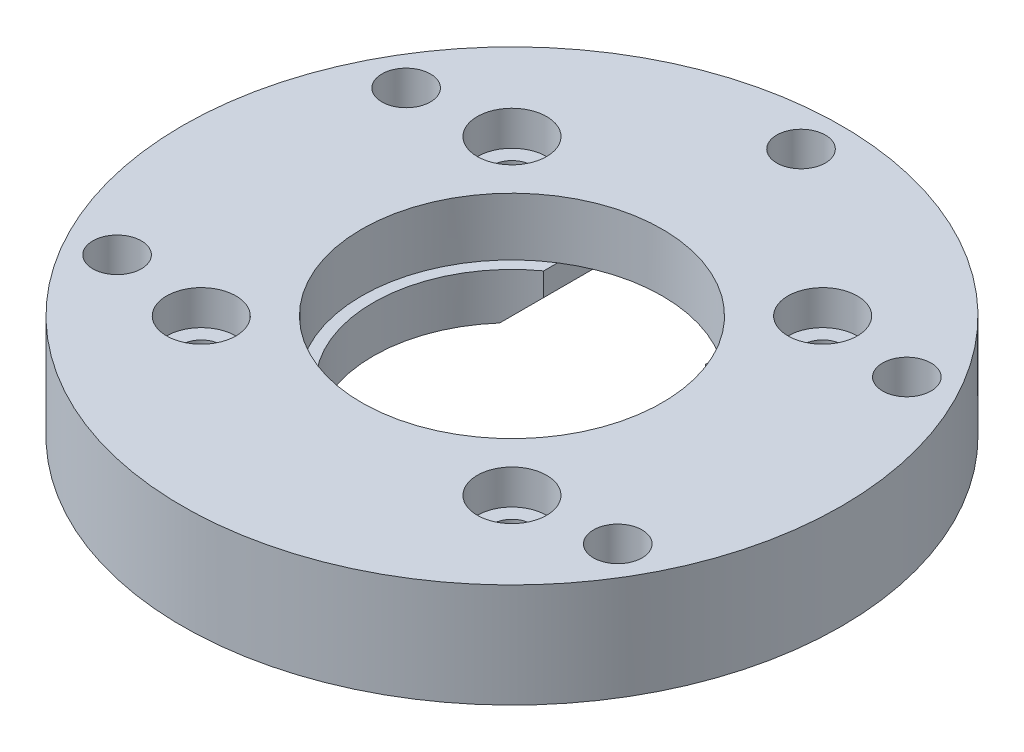
ISO-10303-21;
HEADER;
FILE_DESCRIPTION(('STEP AP214'),'2;1');
FILE_NAME('part.step','',(''),(''),'','','');
FILE_SCHEMA(('AUTOMOTIVE_DESIGN { 1 0 10303 214 1 1 1 1 }'));
ENDSEC;
DATA;
#1=APPLICATION_CONTEXT('core data for automotive mechanical design processes');
#2=APPLICATION_PROTOCOL_DEFINITION('international standard','automotive_design',2000,#1);
#3=PRODUCT_CONTEXT('',#1,'mechanical');
#4=PRODUCT('Part','Part','',(#3));
#5=PRODUCT_RELATED_PRODUCT_CATEGORY('part','',(#4));
#6=PRODUCT_DEFINITION_FORMATION('','',#4);
#7=PRODUCT_DEFINITION_CONTEXT('part definition',#1,'design');
#8=PRODUCT_DEFINITION('design','',#6,#7);
#9=PRODUCT_DEFINITION_SHAPE('','',#8);
#10=(LENGTH_UNIT() NAMED_UNIT(*) SI_UNIT(.MILLI.,.METRE.));
#11=(NAMED_UNIT(*) PLANE_ANGLE_UNIT() SI_UNIT($,.RADIAN.));
#12=(NAMED_UNIT(*) SI_UNIT($,.STERADIAN.) SOLID_ANGLE_UNIT());
#13=UNCERTAINTY_MEASURE_WITH_UNIT(LENGTH_MEASURE(1.E-05),#10,'distance_accuracy_value','');
#14=(GEOMETRIC_REPRESENTATION_CONTEXT(3) GLOBAL_UNCERTAINTY_ASSIGNED_CONTEXT((#13)) GLOBAL_UNIT_ASSIGNED_CONTEXT((#10,
#11,#12)) REPRESENTATION_CONTEXT('',''));
#15=CARTESIAN_POINT('',(0.,0.,0.));
#16=DIRECTION('',(0.,0.,1.));
#17=DIRECTION('',(1.,0.,0.));
#18=AXIS2_PLACEMENT_3D('',#15,#16,#17);
#19=CARTESIAN_POINT('',(0.,5.,0.));
#20=DIRECTION('',(0.,1.,0.));
#21=DIRECTION('',(1.,0.,0.));
#22=AXIS2_PLACEMENT_3D('',#19,#20,#21);
#23=PLANE('',#22);
#24=CARTESIAN_POINT('',(-13.4350288425444,5.,-13.4350288425444));
#25=DIRECTION('',(0.,-1.,0.));
#26=DIRECTION('',(0.,0.,1.));
#27=AXIS2_PLACEMENT_3D('',#24,#25,#26);
#28=CIRCLE('',#27,3.);
#29=CARTESIAN_POINT('',(-13.4350288425444,5.,-10.4350288425444));
#30=VERTEX_POINT('',#29);
#31=EDGE_CURVE('E21',#30,#30,#28,.T.);
#32=ORIENTED_EDGE('',*,*,#31,.T.);
#33=EDGE_LOOP('',(#32));
#34=FACE_BOUND('',#33,.T.);
#35=CARTESIAN_POINT('',(-13.4350288425444,5.,13.4350288425444));
#36=DIRECTION('',(0.,-1.,0.));
#37=DIRECTION('',(1.,0.,0.));
#38=AXIS2_PLACEMENT_3D('',#35,#36,#37);
#39=CIRCLE('',#38,3.);
#40=CARTESIAN_POINT('',(-10.4350288425444,5.,13.4350288425444));
#41=VERTEX_POINT('',#40);
#42=EDGE_CURVE('E279',#41,#41,#39,.T.);
#43=ORIENTED_EDGE('',*,*,#42,.T.);
#44=EDGE_LOOP('',(#43));
#45=FACE_BOUND('',#44,.T.);
#46=CARTESIAN_POINT('',(13.4350288425444,5.,13.4350288425444));
#47=DIRECTION('',(0.,-1.,0.));
#48=DIRECTION('',(0.,0.,-1.));
#49=AXIS2_PLACEMENT_3D('',#46,#47,#48);
#50=CIRCLE('',#49,3.);
#51=CARTESIAN_POINT('',(13.4350288425444,5.,10.4350288425444));
#52=VERTEX_POINT('',#51);
#53=EDGE_CURVE('E267',#52,#52,#50,.T.);
#54=ORIENTED_EDGE('',*,*,#53,.T.);
#55=EDGE_LOOP('',(#54));
#56=FACE_BOUND('',#55,.T.);
#57=CARTESIAN_POINT('',(13.4350288425444,5.,-13.4350288425444));
#58=DIRECTION('',(0.,-1.,0.));
#59=DIRECTION('',(-1.,0.,0.));
#60=AXIS2_PLACEMENT_3D('',#57,#58,#59);
#61=CIRCLE('',#60,3.);
#62=CARTESIAN_POINT('',(10.4350288425444,5.,-13.4350288425444));
#63=VERTEX_POINT('',#62);
#64=EDGE_CURVE('E226',#63,#63,#61,.T.);
#65=ORIENTED_EDGE('',*,*,#64,.T.);
#66=EDGE_LOOP('',(#65));
#67=FACE_BOUND('',#66,.T.);
#68=CARTESIAN_POINT('',(0.,5.,-25.000000372529));
#69=DIRECTION('',(0.,-1.,0.));
#70=DIRECTION('',(0.,0.,1.));
#71=AXIS2_PLACEMENT_3D('',#68,#69,#70);
#72=CIRCLE('',#71,2.1);
#73=CARTESIAN_POINT('',(0.,5.,-22.900000372529));
#74=VERTEX_POINT('',#73);
#75=EDGE_CURVE('E239',#74,#74,#72,.T.);
#76=ORIENTED_EDGE('',*,*,#75,.T.);
#77=EDGE_LOOP('',(#76));
#78=FACE_BOUND('',#77,.T.);
#79=CARTESIAN_POINT('',(-21.6506354172306,5.,-12.5000001862645));
#80=DIRECTION('',(0.,-1.,0.));
#81=DIRECTION('',(0.866025403784439,0.,0.5));
#82=AXIS2_PLACEMENT_3D('',#79,#80,#81);
#83=CIRCLE('',#82,2.1);
#84=CARTESIAN_POINT('',(-19.8319820692833,5.,-11.4500001862645));
#85=VERTEX_POINT('',#84);
#86=EDGE_CURVE('E155',#85,#85,#83,.T.);
#87=ORIENTED_EDGE('',*,*,#86,.T.);
#88=EDGE_LOOP('',(#87));
#89=FACE_BOUND('',#88,.T.);
#90=CARTESIAN_POINT('',(-21.6506354172306,5.,12.5000001862645));
#91=DIRECTION('',(0.,-1.,0.));
#92=DIRECTION('',(0.866025403784439,0.,-0.5));
#93=AXIS2_PLACEMENT_3D('',#90,#91,#92);
#94=CIRCLE('',#93,2.1);
#95=CARTESIAN_POINT('',(-19.8319820692833,5.,11.4500001862645));
#96=VERTEX_POINT('',#95);
#97=EDGE_CURVE('E156',#96,#96,#94,.T.);
#98=ORIENTED_EDGE('',*,*,#97,.T.);
#99=EDGE_LOOP('',(#98));
#100=FACE_BOUND('',#99,.T.);
#101=CARTESIAN_POINT('',(21.6506354172306,5.,12.5000001862645));
#102=DIRECTION('',(0.,-1.,0.));
#103=DIRECTION('',(-0.866025403784438,0.,-0.5));
#104=AXIS2_PLACEMENT_3D('',#101,#102,#103);
#105=CIRCLE('',#104,2.1);
#106=CARTESIAN_POINT('',(19.8319820692833,5.,11.4500001862645));
#107=VERTEX_POINT('',#106);
#108=EDGE_CURVE('E209',#107,#107,#105,.T.);
#109=ORIENTED_EDGE('',*,*,#108,.T.);
#110=EDGE_LOOP('',(#109));
#111=FACE_BOUND('',#110,.T.);
#112=CARTESIAN_POINT('',(21.6506354172306,5.,-12.5000001862645));
#113=DIRECTION('',(0.,-1.,0.));
#114=DIRECTION('',(-0.866025403784439,0.,0.5));
#115=AXIS2_PLACEMENT_3D('',#112,#113,#114);
#116=CIRCLE('',#115,2.1);
#117=CARTESIAN_POINT('',(19.8319820692833,5.,-11.4500001862645));
#118=VERTEX_POINT('',#117);
#119=EDGE_CURVE('E210',#118,#118,#116,.T.);
#120=ORIENTED_EDGE('',*,*,#119,.T.);
#121=EDGE_LOOP('',(#120));
#122=FACE_BOUND('',#121,.T.);
#123=CARTESIAN_POINT('',(0.,5.,0.));
#124=DIRECTION('',(0.,-1.,0.));
#125=DIRECTION('',(-1.,0.,0.));
#126=AXIS2_PLACEMENT_3D('',#123,#124,#125);
#127=CIRCLE('',#126,13.);
#128=CARTESIAN_POINT('',(-13.,5.,0.));
#129=VERTEX_POINT('',#128);
#130=EDGE_CURVE('E108',#129,#129,#127,.T.);
#131=ORIENTED_EDGE('',*,*,#130,.T.);
#132=EDGE_LOOP('',(#131));
#133=FACE_BOUND('',#132,.T.);
#134=CARTESIAN_POINT('',(0.,5.,0.));
#135=DIRECTION('',(0.,1.,0.));
#136=DIRECTION('',(1.,0.,0.));
#137=AXIS2_PLACEMENT_3D('',#134,#135,#136);
#138=CIRCLE('',#137,28.5);
#139=CARTESIAN_POINT('',(28.5,5.,0.));
#140=VERTEX_POINT('',#139);
#141=EDGE_CURVE('E11',#140,#140,#138,.T.);
#142=ORIENTED_EDGE('',*,*,#141,.T.);
#143=EDGE_LOOP('',(#142));
#144=FACE_BOUND('',#143,.T.);
#145=ADVANCED_FACE('F17',(#34,#45,#56,#67,#78,#89,#100,#111,#122,#133,#144),#23,.T.);
#146=CARTESIAN_POINT('',(0.,0.,0.));
#147=DIRECTION('',(0.,1.,0.));
#148=DIRECTION('',(1.,0.,0.));
#149=AXIS2_PLACEMENT_3D('',#146,#147,#148);
#150=CYLINDRICAL_SURFACE('',#149,28.5);
#151=CARTESIAN_POINT('',(0.,5.,0.));
#152=DIRECTION('',(0.707106781186548,-0.707106781186547,0.));
#153=DIRECTION('',(0.707106781186547,0.707106781186548,0.));
#154=AXIS2_PLACEMENT_3D('',#151,#152,#153);
#155=ELLIPSE('',#154,40.3050865276332,28.5);
#156=CARTESIAN_POINT('',(-9.,-4.,-27.0416345659799));
#157=VERTEX_POINT('',#156);
#158=CARTESIAN_POINT('',(-7.,-2.,-27.6269795670826));
#159=VERTEX_POINT('',#158);
#160=EDGE_CURVE('E128',#157,#159,#155,.T.);
#161=ORIENTED_EDGE('',*,*,#160,.F.);
#162=CARTESIAN_POINT('',(0.,-4.,0.));
#163=DIRECTION('',(0.,-1.,0.));
#164=DIRECTION('',(1.,0.,0.));
#165=AXIS2_PLACEMENT_3D('',#162,#163,#164);
#166=CIRCLE('',#165,28.5);
#167=CARTESIAN_POINT('',(9.,-4.,-27.0416345659799));
#168=VERTEX_POINT('',#167);
#169=EDGE_CURVE('E176',#168,#157,#166,.T.);
#170=ORIENTED_EDGE('',*,*,#169,.F.);
#171=CARTESIAN_POINT('',(0.,5.,0.));
#172=DIRECTION('',(-0.707106781186548,-0.707106781186547,0.));
#173=DIRECTION('',(0.707106781186547,-0.707106781186548,0.));
#174=AXIS2_PLACEMENT_3D('',#171,#172,#173);
#175=ELLIPSE('',#174,40.3050865276332,28.5);
#176=CARTESIAN_POINT('',(7.,-2.,-27.6269795670826));
#177=VERTEX_POINT('',#176);
#178=EDGE_CURVE('E131',#177,#168,#175,.T.);
#179=ORIENTED_EDGE('',*,*,#178,.F.);
#180=DIRECTION('',(0.,-1.,0.));
#181=VECTOR('',#180,1.);
#182=CARTESIAN_POINT('',(7.,0.,-27.6269795670826));
#183=LINE('',#182,#181);
#184=CARTESIAN_POINT('',(7.,0.,-27.6269795670826));
#185=VERTEX_POINT('',#184);
#186=EDGE_CURVE('E105',#185,#177,#183,.T.);
#187=ORIENTED_EDGE('',*,*,#186,.F.);
#188=CARTESIAN_POINT('',(0.,0.,0.));
#189=DIRECTION('',(0.,1.,0.));
#190=DIRECTION('',(1.,0.,0.));
#191=AXIS2_PLACEMENT_3D('',#188,#189,#190);
#192=CIRCLE('',#191,28.5);
#193=CARTESIAN_POINT('',(-7.,0.,-27.6269795670826));
#194=VERTEX_POINT('',#193);
#195=EDGE_CURVE('E39',#185,#194,#192,.T.);
#196=ORIENTED_EDGE('',*,*,#195,.T.);
#197=DIRECTION('',(0.,-1.,0.));
#198=VECTOR('',#197,1.);
#199=CARTESIAN_POINT('',(-7.,0.,-27.6269795670826));
#200=LINE('',#199,#198);
#201=EDGE_CURVE('E102',#194,#159,#200,.T.);
#202=ORIENTED_EDGE('',*,*,#201,.T.);
#203=EDGE_LOOP('',(#161,#170,#179,#187,#196,#202));
#204=FACE_BOUND('',#203,.T.);
#205=ORIENTED_EDGE('',*,*,#141,.F.);
#206=EDGE_LOOP('',(#205));
#207=FACE_BOUND('',#206,.T.);
#208=ADVANCED_FACE('F99',(#204,#207),#150,.T.);
#209=CARTESIAN_POINT('',(-13.4350288425444,-45.,-13.4350288425444));
#210=DIRECTION('',(0.,-1.,0.));
#211=DIRECTION('',(0.,0.,1.));
#212=AXIS2_PLACEMENT_3D('',#209,#210,#211);
#213=CYLINDRICAL_SURFACE('',#212,1.7);
#214=CARTESIAN_POINT('',(-13.4350288425444,-4.,-13.4350288425444));
#215=DIRECTION('',(0.,1.,0.));
#216=DIRECTION('',(1.,0.,0.));
#217=AXIS2_PLACEMENT_3D('',#214,#215,#216);
#218=CIRCLE('',#217,1.7);
#219=CARTESIAN_POINT('',(-11.7350288425444,-4.,-13.4350288425444));
#220=VERTEX_POINT('',#219);
#221=EDGE_CURVE('E168',#220,#220,#218,.T.);
#222=ORIENTED_EDGE('',*,*,#221,.F.);
#223=EDGE_LOOP('',(#222));
#224=FACE_BOUND('',#223,.T.);
#225=CARTESIAN_POINT('',(-13.4350288425444,2.,-13.4350288425444));
#226=DIRECTION('',(0.,-1.,0.));
#227=DIRECTION('',(0.,0.,1.));
#228=AXIS2_PLACEMENT_3D('',#225,#226,#227);
#229=CIRCLE('',#228,1.7);
#230=CARTESIAN_POINT('',(-13.4350288425444,2.,-11.7350288425444));
#231=VERTEX_POINT('',#230);
#232=EDGE_CURVE('E286',#231,#231,#229,.T.);
#233=ORIENTED_EDGE('',*,*,#232,.F.);
#234=EDGE_LOOP('',(#233));
#235=FACE_BOUND('',#234,.T.);
#236=ADVANCED_FACE('F19',(#224,#235),#213,.F.);
#237=CARTESIAN_POINT('',(-13.4350288425444,3.5,-13.4350288425444));
#238=DIRECTION('',(0.,-1.,0.));
#239=DIRECTION('',(0.,0.,1.));
#240=AXIS2_PLACEMENT_3D('',#237,#238,#239);
#241=CYLINDRICAL_SURFACE('',#240,3.);
#242=CARTESIAN_POINT('',(-13.4350288425444,2.,-13.4350288425444));
#243=DIRECTION('',(0.,-1.,0.));
#244=DIRECTION('',(0.,0.,1.));
#245=AXIS2_PLACEMENT_3D('',#242,#243,#244);
#246=CIRCLE('',#245,3.);
#247=CARTESIAN_POINT('',(-13.4350288425444,2.,-10.4350288425444));
#248=VERTEX_POINT('',#247);
#249=EDGE_CURVE('E283',#248,#248,#246,.T.);
#250=ORIENTED_EDGE('',*,*,#249,.T.);
#251=EDGE_LOOP('',(#250));
#252=FACE_BOUND('',#251,.T.);
#253=ORIENTED_EDGE('',*,*,#31,.F.);
#254=EDGE_LOOP('',(#253));
#255=FACE_BOUND('',#254,.T.);
#256=ADVANCED_FACE('F301',(#252,#255),#241,.F.);
#257=CARTESIAN_POINT('',(-13.4350288425444,2.,-13.4350288425444));
#258=DIRECTION('',(0.,-1.,0.));
#259=DIRECTION('',(0.,0.,-1.));
#260=AXIS2_PLACEMENT_3D('',#257,#258,#259);
#261=PLANE('',#260);
#262=ORIENTED_EDGE('',*,*,#232,.T.);
#263=EDGE_LOOP('',(#262));
#264=FACE_BOUND('',#263,.T.);
#265=ORIENTED_EDGE('',*,*,#249,.F.);
#266=EDGE_LOOP('',(#265));
#267=FACE_BOUND('',#266,.T.);
#268=ADVANCED_FACE('F303',(#264,#267),#261,.F.);
#269=CARTESIAN_POINT('',(-13.4350288425444,-45.,13.4350288425444));
#270=DIRECTION('',(0.,-1.,0.));
#271=DIRECTION('',(1.,0.,0.));
#272=AXIS2_PLACEMENT_3D('',#269,#270,#271);
#273=CYLINDRICAL_SURFACE('',#272,1.7);
#274=CARTESIAN_POINT('',(-13.4350288425444,-4.,13.4350288425444));
#275=DIRECTION('',(0.,1.,0.));
#276=DIRECTION('',(1.,0.,0.));
#277=AXIS2_PLACEMENT_3D('',#274,#275,#276);
#278=CIRCLE('',#277,1.7);
#279=CARTESIAN_POINT('',(-11.7350288425444,-4.,13.4350288425444));
#280=VERTEX_POINT('',#279);
#281=EDGE_CURVE('E136',#280,#280,#278,.T.);
#282=ORIENTED_EDGE('',*,*,#281,.F.);
#283=EDGE_LOOP('',(#282));
#284=FACE_BOUND('',#283,.T.);
#285=CARTESIAN_POINT('',(-13.4350288425444,2.,13.4350288425444));
#286=DIRECTION('',(0.,-1.,0.));
#287=DIRECTION('',(1.,0.,0.));
#288=AXIS2_PLACEMENT_3D('',#285,#286,#287);
#289=CIRCLE('',#288,1.7);
#290=CARTESIAN_POINT('',(-11.7350288425444,2.,13.4350288425444));
#291=VERTEX_POINT('',#290);
#292=EDGE_CURVE('E275',#291,#291,#289,.T.);
#293=ORIENTED_EDGE('',*,*,#292,.F.);
#294=EDGE_LOOP('',(#293));
#295=FACE_BOUND('',#294,.T.);
#296=ADVANCED_FACE('F310',(#284,#295),#273,.F.);
#297=CARTESIAN_POINT('',(-13.4350288425444,3.5,13.4350288425444));
#298=DIRECTION('',(0.,-1.,0.));
#299=DIRECTION('',(1.,0.,0.));
#300=AXIS2_PLACEMENT_3D('',#297,#298,#299);
#301=CYLINDRICAL_SURFACE('',#300,3.);
#302=CARTESIAN_POINT('',(-13.4350288425444,2.,13.4350288425444));
#303=DIRECTION('',(0.,-1.,0.));
#304=DIRECTION('',(1.,0.,0.));
#305=AXIS2_PLACEMENT_3D('',#302,#303,#304);
#306=CIRCLE('',#305,3.);
#307=CARTESIAN_POINT('',(-10.4350288425444,2.,13.4350288425444));
#308=VERTEX_POINT('',#307);
#309=EDGE_CURVE('E271',#308,#308,#306,.T.);
#310=ORIENTED_EDGE('',*,*,#309,.T.);
#311=EDGE_LOOP('',(#310));
#312=FACE_BOUND('',#311,.T.);
#313=ORIENTED_EDGE('',*,*,#42,.F.);
#314=EDGE_LOOP('',(#313));
#315=FACE_BOUND('',#314,.T.);
#316=ADVANCED_FACE('F375',(#312,#315),#301,.F.);
#317=CARTESIAN_POINT('',(-13.4350288425444,2.,13.4350288425444));
#318=DIRECTION('',(0.,-1.,0.));
#319=DIRECTION('',(0.,0.,-1.));
#320=AXIS2_PLACEMENT_3D('',#317,#318,#319);
#321=PLANE('',#320);
#322=ORIENTED_EDGE('',*,*,#292,.T.);
#323=EDGE_LOOP('',(#322));
#324=FACE_BOUND('',#323,.T.);
#325=ORIENTED_EDGE('',*,*,#309,.F.);
#326=EDGE_LOOP('',(#325));
#327=FACE_BOUND('',#326,.T.);
#328=ADVANCED_FACE('F371',(#324,#327),#321,.F.);
#329=CARTESIAN_POINT('',(13.4350288425444,-45.,13.4350288425444));
#330=DIRECTION('',(0.,-1.,0.));
#331=DIRECTION('',(0.,0.,-1.));
#332=AXIS2_PLACEMENT_3D('',#329,#330,#331);
#333=CYLINDRICAL_SURFACE('',#332,1.7);
#334=CARTESIAN_POINT('',(13.4350288425444,-4.,13.4350288425444));
#335=DIRECTION('',(0.,1.,0.));
#336=DIRECTION('',(1.,0.,0.));
#337=AXIS2_PLACEMENT_3D('',#334,#335,#336);
#338=CIRCLE('',#337,1.7);
#339=CARTESIAN_POINT('',(15.1350288425444,-4.,13.4350288425444));
#340=VERTEX_POINT('',#339);
#341=EDGE_CURVE('E164',#340,#340,#338,.T.);
#342=ORIENTED_EDGE('',*,*,#341,.F.);
#343=EDGE_LOOP('',(#342));
#344=FACE_BOUND('',#343,.T.);
#345=CARTESIAN_POINT('',(13.4350288425444,2.,13.4350288425444));
#346=DIRECTION('',(0.,-1.,0.));
#347=DIRECTION('',(0.,0.,-1.));
#348=AXIS2_PLACEMENT_3D('',#345,#346,#347);
#349=CIRCLE('',#348,1.7);
#350=CARTESIAN_POINT('',(13.4350288425444,2.,11.7350288425444));
#351=VERTEX_POINT('',#350);
#352=EDGE_CURVE('E263',#351,#351,#349,.T.);
#353=ORIENTED_EDGE('',*,*,#352,.F.);
#354=EDGE_LOOP('',(#353));
#355=FACE_BOUND('',#354,.T.);
#356=ADVANCED_FACE('F367',(#344,#355),#333,.F.);
#357=CARTESIAN_POINT('',(13.4350288425444,3.5,13.4350288425444));
#358=DIRECTION('',(0.,-1.,0.));
#359=DIRECTION('',(0.,0.,-1.));
#360=AXIS2_PLACEMENT_3D('',#357,#358,#359);
#361=CYLINDRICAL_SURFACE('',#360,3.);
#362=CARTESIAN_POINT('',(13.4350288425444,2.,13.4350288425444));
#363=DIRECTION('',(0.,-1.,0.));
#364=DIRECTION('',(0.,0.,-1.));
#365=AXIS2_PLACEMENT_3D('',#362,#363,#364);
#366=CIRCLE('',#365,3.);
#367=CARTESIAN_POINT('',(13.4350288425444,2.,10.4350288425444));
#368=VERTEX_POINT('',#367);
#369=EDGE_CURVE('E230',#368,#368,#366,.T.);
#370=ORIENTED_EDGE('',*,*,#369,.T.);
#371=EDGE_LOOP('',(#370));
#372=FACE_BOUND('',#371,.T.);
#373=ORIENTED_EDGE('',*,*,#53,.F.);
#374=EDGE_LOOP('',(#373));
#375=FACE_BOUND('',#374,.T.);
#376=ADVANCED_FACE('F363',(#372,#375),#361,.F.);
#377=CARTESIAN_POINT('',(13.4350288425444,2.,13.4350288425444));
#378=DIRECTION('',(0.,-1.,0.));
#379=DIRECTION('',(0.,0.,-1.));
#380=AXIS2_PLACEMENT_3D('',#377,#378,#379);
#381=PLANE('',#380);
#382=ORIENTED_EDGE('',*,*,#352,.T.);
#383=EDGE_LOOP('',(#382));
#384=FACE_BOUND('',#383,.T.);
#385=ORIENTED_EDGE('',*,*,#369,.F.);
#386=EDGE_LOOP('',(#385));
#387=FACE_BOUND('',#386,.T.);
#388=ADVANCED_FACE('F359',(#384,#387),#381,.F.);
#389=CARTESIAN_POINT('',(13.4350288425444,-45.,-13.4350288425444));
#390=DIRECTION('',(0.,-1.,0.));
#391=DIRECTION('',(-1.,0.,0.));
#392=AXIS2_PLACEMENT_3D('',#389,#390,#391);
#393=CYLINDRICAL_SURFACE('',#392,1.7);
#394=CARTESIAN_POINT('',(13.4350288425444,-4.,-13.4350288425444));
#395=DIRECTION('',(0.,1.,0.));
#396=DIRECTION('',(1.,0.,0.));
#397=AXIS2_PLACEMENT_3D('',#394,#395,#396);
#398=CIRCLE('',#397,1.7);
#399=CARTESIAN_POINT('',(15.1350288425444,-4.,-13.4350288425444));
#400=VERTEX_POINT('',#399);
#401=EDGE_CURVE('E140',#400,#400,#398,.T.);
#402=ORIENTED_EDGE('',*,*,#401,.F.);
#403=EDGE_LOOP('',(#402));
#404=FACE_BOUND('',#403,.T.);
#405=CARTESIAN_POINT('',(13.4350288425444,2.,-13.4350288425444));
#406=DIRECTION('',(0.,-1.,0.));
#407=DIRECTION('',(-1.,0.,0.));
#408=AXIS2_PLACEMENT_3D('',#405,#406,#407);
#409=CIRCLE('',#408,1.7);
#410=CARTESIAN_POINT('',(11.7350288425444,2.,-13.4350288425444));
#411=VERTEX_POINT('',#410);
#412=EDGE_CURVE('E231',#411,#411,#409,.T.);
#413=ORIENTED_EDGE('',*,*,#412,.F.);
#414=EDGE_LOOP('',(#413));
#415=FACE_BOUND('',#414,.T.);
#416=ADVANCED_FACE('F355',(#404,#415),#393,.F.);
#417=CARTESIAN_POINT('',(13.4350288425444,3.5,-13.4350288425444));
#418=DIRECTION('',(0.,-1.,0.));
#419=DIRECTION('',(-1.,0.,0.));
#420=AXIS2_PLACEMENT_3D('',#417,#418,#419);
#421=CYLINDRICAL_SURFACE('',#420,3.);
#422=CARTESIAN_POINT('',(13.4350288425444,2.,-13.4350288425444));
#423=DIRECTION('',(0.,-1.,0.));
#424=DIRECTION('',(-1.,0.,0.));
#425=AXIS2_PLACEMENT_3D('',#422,#423,#424);
#426=CIRCLE('',#425,3.);
#427=CARTESIAN_POINT('',(10.4350288425444,2.,-13.4350288425444));
#428=VERTEX_POINT('',#427);
#429=EDGE_CURVE('E253',#428,#428,#426,.T.);
#430=ORIENTED_EDGE('',*,*,#429,.T.);
#431=EDGE_LOOP('',(#430));
#432=FACE_BOUND('',#431,.T.);
#433=ORIENTED_EDGE('',*,*,#64,.F.);
#434=EDGE_LOOP('',(#433));
#435=FACE_BOUND('',#434,.T.);
#436=ADVANCED_FACE('F351',(#432,#435),#421,.F.);
#437=CARTESIAN_POINT('',(13.4350288425444,2.,-13.4350288425444));
#438=DIRECTION('',(0.,-1.,0.));
#439=DIRECTION('',(0.,0.,-1.));
#440=AXIS2_PLACEMENT_3D('',#437,#438,#439);
#441=PLANE('',#440);
#442=ORIENTED_EDGE('',*,*,#412,.T.);
#443=EDGE_LOOP('',(#442));
#444=FACE_BOUND('',#443,.T.);
#445=ORIENTED_EDGE('',*,*,#429,.F.);
#446=EDGE_LOOP('',(#445));
#447=FACE_BOUND('',#446,.T.);
#448=ADVANCED_FACE('F347',(#444,#447),#441,.F.);
#449=CARTESIAN_POINT('',(0.,1.,-25.000000372529));
#450=DIRECTION('',(0.,-1.,0.));
#451=DIRECTION('',(0.,0.,-1.));
#452=AXIS2_PLACEMENT_3D('',#449,#450,#451);
#453=PLANE('',#452);
#454=CARTESIAN_POINT('',(0.,1.,-25.000000372529));
#455=DIRECTION('',(0.,-1.,0.));
#456=DIRECTION('',(0.,0.,1.));
#457=AXIS2_PLACEMENT_3D('',#454,#455,#456);
#458=CIRCLE('',#457,2.1);
#459=CARTESIAN_POINT('',(0.,1.,-22.900000372529));
#460=VERTEX_POINT('',#459);
#461=EDGE_CURVE('E249',#460,#460,#458,.T.);
#462=ORIENTED_EDGE('',*,*,#461,.F.);
#463=EDGE_LOOP('',(#462));
#464=FACE_BOUND('',#463,.T.);
#465=ADVANCED_FACE('F343',(#464),#453,.F.);
#466=CARTESIAN_POINT('',(0.,3.,-25.000000372529));
#467=DIRECTION('',(0.,-1.,0.));
#468=DIRECTION('',(0.,0.,1.));
#469=AXIS2_PLACEMENT_3D('',#466,#467,#468);
#470=CYLINDRICAL_SURFACE('',#469,2.1);
#471=ORIENTED_EDGE('',*,*,#461,.T.);
#472=EDGE_LOOP('',(#471));
#473=FACE_BOUND('',#472,.T.);
#474=ORIENTED_EDGE('',*,*,#75,.F.);
#475=EDGE_LOOP('',(#474));
#476=FACE_BOUND('',#475,.T.);
#477=ADVANCED_FACE('F339',(#473,#476),#470,.F.);
#478=CARTESIAN_POINT('',(-21.6506354172306,1.,-12.5000001862645));
#479=DIRECTION('',(0.,-1.,0.));
#480=DIRECTION('',(0.,0.,-1.));
#481=AXIS2_PLACEMENT_3D('',#478,#479,#480);
#482=PLANE('',#481);
#483=CARTESIAN_POINT('',(-21.6506354172306,1.,-12.5000001862645));
#484=DIRECTION('',(0.,-1.,0.));
#485=DIRECTION('',(0.866025403784439,0.,0.5));
#486=AXIS2_PLACEMENT_3D('',#483,#484,#485);
#487=CIRCLE('',#486,2.1);
#488=CARTESIAN_POINT('',(-19.8319820692833,1.,-11.4500001862645));
#489=VERTEX_POINT('',#488);
#490=EDGE_CURVE('E235',#489,#489,#487,.T.);
#491=ORIENTED_EDGE('',*,*,#490,.F.);
#492=EDGE_LOOP('',(#491));
#493=FACE_BOUND('',#492,.T.);
#494=ADVANCED_FACE('F327',(#493),#482,.F.);
#495=CARTESIAN_POINT('',(-21.6506354172306,3.,-12.5000001862645));
#496=DIRECTION('',(0.,-1.,0.));
#497=DIRECTION('',(0.866025403784439,0.,0.5));
#498=AXIS2_PLACEMENT_3D('',#495,#496,#497);
#499=CYLINDRICAL_SURFACE('',#498,2.1);
#500=ORIENTED_EDGE('',*,*,#490,.T.);
#501=EDGE_LOOP('',(#500));
#502=FACE_BOUND('',#501,.T.);
#503=ORIENTED_EDGE('',*,*,#86,.F.);
#504=EDGE_LOOP('',(#503));
#505=FACE_BOUND('',#504,.T.);
#506=ADVANCED_FACE('F323',(#502,#505),#499,.F.);
#507=CARTESIAN_POINT('',(-21.6506354172306,1.,12.5000001862645));
#508=DIRECTION('',(0.,-1.,0.));
#509=DIRECTION('',(0.,0.,-1.));
#510=AXIS2_PLACEMENT_3D('',#507,#508,#509);
#511=PLANE('',#510);
#512=CARTESIAN_POINT('',(-21.6506354172306,1.,12.5000001862645));
#513=DIRECTION('',(0.,-1.,0.));
#514=DIRECTION('',(0.866025403784439,0.,-0.5));
#515=AXIS2_PLACEMENT_3D('',#512,#513,#514);
#516=CIRCLE('',#515,2.1);
#517=CARTESIAN_POINT('',(-19.8319820692833,1.,11.4500001862645));
#518=VERTEX_POINT('',#517);
#519=EDGE_CURVE('E151',#518,#518,#516,.T.);
#520=ORIENTED_EDGE('',*,*,#519,.F.);
#521=EDGE_LOOP('',(#520));
#522=FACE_BOUND('',#521,.T.);
#523=ADVANCED_FACE('F326',(#522),#511,.F.);
#524=CARTESIAN_POINT('',(-21.6506354172306,3.,12.5000001862645));
#525=DIRECTION('',(0.,-1.,0.));
#526=DIRECTION('',(0.866025403784439,0.,-0.5));
#527=AXIS2_PLACEMENT_3D('',#524,#525,#526);
#528=CYLINDRICAL_SURFACE('',#527,2.1);
#529=ORIENTED_EDGE('',*,*,#519,.T.);
#530=EDGE_LOOP('',(#529));
#531=FACE_BOUND('',#530,.T.);
#532=ORIENTED_EDGE('',*,*,#97,.F.);
#533=EDGE_LOOP('',(#532));
#534=FACE_BOUND('',#533,.T.);
#535=ADVANCED_FACE('F329',(#531,#534),#528,.F.);
#536=CARTESIAN_POINT('',(21.6506354172306,1.,12.5000001862645));
#537=DIRECTION('',(0.,-1.,0.));
#538=DIRECTION('',(0.,0.,-1.));
#539=AXIS2_PLACEMENT_3D('',#536,#537,#538);
#540=PLANE('',#539);
#541=CARTESIAN_POINT('',(21.6506354172306,1.,12.5000001862645));
#542=DIRECTION('',(0.,-1.,0.));
#543=DIRECTION('',(-0.866025403784438,0.,-0.5));
#544=AXIS2_PLACEMENT_3D('',#541,#542,#543);
#545=CIRCLE('',#544,2.1);
#546=CARTESIAN_POINT('',(19.8319820692833,1.,11.4500001862645));
#547=VERTEX_POINT('',#546);
#548=EDGE_CURVE('E191',#547,#547,#545,.T.);
#549=ORIENTED_EDGE('',*,*,#548,.F.);
#550=EDGE_LOOP('',(#549));
#551=FACE_BOUND('',#550,.T.);
#552=ADVANCED_FACE('F332',(#551),#540,.F.);
#553=CARTESIAN_POINT('',(21.6506354172306,3.,12.5000001862645));
#554=DIRECTION('',(0.,-1.,0.));
#555=DIRECTION('',(-0.866025403784438,0.,-0.5));
#556=AXIS2_PLACEMENT_3D('',#553,#554,#555);
#557=CYLINDRICAL_SURFACE('',#556,2.1);
#558=ORIENTED_EDGE('',*,*,#548,.T.);
#559=EDGE_LOOP('',(#558));
#560=FACE_BOUND('',#559,.T.);
#561=ORIENTED_EDGE('',*,*,#108,.F.);
#562=EDGE_LOOP('',(#561));
#563=FACE_BOUND('',#562,.T.);
#564=ADVANCED_FACE('F321',(#560,#563),#557,.F.);
#565=CARTESIAN_POINT('',(21.6506354172306,1.,-12.5000001862645));
#566=DIRECTION('',(0.,-1.,0.));
#567=DIRECTION('',(0.,0.,-1.));
#568=AXIS2_PLACEMENT_3D('',#565,#566,#567);
#569=PLANE('',#568);
#570=CARTESIAN_POINT('',(21.6506354172306,1.,-12.5000001862645));
#571=DIRECTION('',(0.,-1.,0.));
#572=DIRECTION('',(-0.866025403784439,0.,0.5));
#573=AXIS2_PLACEMENT_3D('',#570,#571,#572);
#574=CIRCLE('',#573,2.1);
#575=CARTESIAN_POINT('',(19.8319820692833,1.,-11.4500001862645));
#576=VERTEX_POINT('',#575);
#577=EDGE_CURVE('E205',#576,#576,#574,.T.);
#578=ORIENTED_EDGE('',*,*,#577,.F.);
#579=EDGE_LOOP('',(#578));
#580=FACE_BOUND('',#579,.T.);
#581=ADVANCED_FACE('F417',(#580),#569,.F.);
#582=CARTESIAN_POINT('',(21.6506354172306,3.,-12.5000001862645));
#583=DIRECTION('',(0.,-1.,0.));
#584=DIRECTION('',(-0.866025403784439,0.,0.5));
#585=AXIS2_PLACEMENT_3D('',#582,#583,#584);
#586=CYLINDRICAL_SURFACE('',#585,2.1);
#587=ORIENTED_EDGE('',*,*,#577,.T.);
#588=EDGE_LOOP('',(#587));
#589=FACE_BOUND('',#588,.T.);
#590=ORIENTED_EDGE('',*,*,#119,.F.);
#591=EDGE_LOOP('',(#590));
#592=FACE_BOUND('',#591,.T.);
#593=ADVANCED_FACE('F408',(#589,#592),#586,.F.);
#594=CARTESIAN_POINT('',(0.,5.,0.));
#595=DIRECTION('',(0.,-1.,0.));
#596=DIRECTION('',(-1.,0.,0.));
#597=AXIS2_PLACEMENT_3D('',#594,#595,#596);
#598=CYLINDRICAL_SURFACE('',#597,13.);
#599=CARTESIAN_POINT('',(0.,0.,0.));
#600=DIRECTION('',(0.,1.,0.));
#601=DIRECTION('',(-1.,0.,0.));
#602=AXIS2_PLACEMENT_3D('',#599,#600,#601);
#603=CIRCLE('',#602,13.);
#604=CARTESIAN_POINT('',(7.,0.,-10.9544511501033));
#605=VERTEX_POINT('',#604);
#606=CARTESIAN_POINT('',(-7.,0.,-10.9544511501033));
#607=VERTEX_POINT('',#606);
#608=EDGE_CURVE('E109',#605,#607,#603,.T.);
#609=ORIENTED_EDGE('',*,*,#608,.F.);
#610=CARTESIAN_POINT('',(0.,0.,0.));
#611=DIRECTION('',(0.,1.,0.));
#612=DIRECTION('',(-1.,0.,0.));
#613=AXIS2_PLACEMENT_3D('',#610,#611,#612);
#614=CIRCLE('',#613,13.);
#615=EDGE_CURVE('E49',#607,#605,#614,.T.);
#616=ORIENTED_EDGE('',*,*,#615,.F.);
#617=EDGE_LOOP('',(#609,#616));
#618=FACE_BOUND('',#617,.T.);
#619=ORIENTED_EDGE('',*,*,#130,.F.);
#620=EDGE_LOOP('',(#619));
#621=FACE_BOUND('',#620,.T.);
#622=ADVANCED_FACE('F406',(#618,#621),#598,.F.);
#623=CARTESIAN_POINT('',(0.,0.,0.));
#624=DIRECTION('',(0.,1.,0.));
#625=DIRECTION('',(1.,0.,0.));
#626=AXIS2_PLACEMENT_3D('',#623,#624,#625);
#627=PLANE('',#626);
#628=DIRECTION('',(0.,0.,1.));
#629=VECTOR('',#628,1.);
#630=CARTESIAN_POINT('',(7.,0.,-4.87339717240448));
#631=LINE('',#630,#629);
#632=EDGE_CURVE('E159',#185,#605,#631,.T.);
#633=ORIENTED_EDGE('',*,*,#632,.T.);
#634=ORIENTED_EDGE('',*,*,#608,.T.);
#635=DIRECTION('',(0.,0.,-1.));
#636=VECTOR('',#635,1.);
#637=CARTESIAN_POINT('',(-7.,0.,-13.8134897835413));
#638=LINE('',#637,#636);
#639=EDGE_CURVE('E112',#607,#194,#638,.T.);
#640=ORIENTED_EDGE('',*,*,#639,.T.);
#641=ORIENTED_EDGE('',*,*,#195,.F.);
#642=EDGE_LOOP('',(#633,#634,#640,#641));
#643=FACE_BOUND('',#642,.T.);
#644=ADVANCED_FACE('F113',(#643),#627,.F.);
#645=CARTESIAN_POINT('',(0.,0.,0.436510216458692));
#646=DIRECTION('',(0.,-1.,0.));
#647=DIRECTION('',(0.,0.,-1.));
#648=AXIS2_PLACEMENT_3D('',#645,#646,#647);
#649=PLANE('',#648);
#650=ORIENTED_EDGE('',*,*,#615,.T.);
#651=DIRECTION('',(0.,0.,-1.));
#652=VECTOR('',#651,1.);
#653=CARTESIAN_POINT('',(7.,0.,28.5));
#654=LINE('',#653,#652);
#655=CARTESIAN_POINT('',(7.,0.,-9.74679434480897));
#656=VERTEX_POINT('',#655);
#657=EDGE_CURVE('E204',#656,#605,#654,.T.);
#658=ORIENTED_EDGE('',*,*,#657,.F.);
#659=CARTESIAN_POINT('',(0.,0.,0.));
#660=DIRECTION('',(0.,-1.,0.));
#661=DIRECTION('',(1.,0.,0.));
#662=AXIS2_PLACEMENT_3D('',#659,#660,#661);
#663=CIRCLE('',#662,12.);
#664=CARTESIAN_POINT('',(-7.,0.,-9.74679434480897));
#665=VERTEX_POINT('',#664);
#666=EDGE_CURVE('E181',#656,#665,#663,.T.);
#667=ORIENTED_EDGE('',*,*,#666,.T.);
#668=DIRECTION('',(0.,0.,1.));
#669=VECTOR('',#668,1.);
#670=CARTESIAN_POINT('',(-7.,0.,-28.5));
#671=LINE('',#670,#669);
#672=EDGE_CURVE('E116',#607,#665,#671,.T.);
#673=ORIENTED_EDGE('',*,*,#672,.F.);
#674=EDGE_LOOP('',(#650,#658,#667,#673));
#675=FACE_BOUND('',#674,.T.);
#676=ADVANCED_FACE('F415',(#675),#649,.F.);
#677=CARTESIAN_POINT('',(7.,0.,-9.74679434480897));
#678=DIRECTION('',(-1.,0.,0.));
#679=DIRECTION('',(0.,0.,1.));
#680=AXIS2_PLACEMENT_3D('',#677,#678,#679);
#681=PLANE('',#680);
#682=DIRECTION('',(0.,0.,-1.));
#683=VECTOR('',#682,1.);
#684=CARTESIAN_POINT('',(7.,-2.,-4.65514206417514));
#685=LINE('',#684,#683);
#686=CARTESIAN_POINT('',(7.,-2.,-9.74679434480897));
#687=VERTEX_POINT('',#686);
#688=EDGE_CURVE('E163',#687,#177,#685,.T.);
#689=ORIENTED_EDGE('',*,*,#688,.F.);
#690=DIRECTION('',(0.,-1.,0.));
#691=VECTOR('',#690,1.);
#692=CARTESIAN_POINT('',(7.,0.,-9.74679434480897));
#693=LINE('',#692,#691);
#694=EDGE_CURVE('E185',#656,#687,#693,.T.);
#695=ORIENTED_EDGE('',*,*,#694,.F.);
#696=ORIENTED_EDGE('',*,*,#657,.T.);
#697=ORIENTED_EDGE('',*,*,#632,.F.);
#698=ORIENTED_EDGE('',*,*,#186,.T.);
#699=EDGE_LOOP('',(#689,#695,#696,#697,#698));
#700=FACE_BOUND('',#699,.T.);
#701=ADVANCED_FACE('F444',(#700),#681,.T.);
#702=CARTESIAN_POINT('',(-7.,0.,-27.6269795670826));
#703=DIRECTION('',(1.,0.,0.));
#704=DIRECTION('',(0.,1.,0.));
#705=AXIS2_PLACEMENT_3D('',#702,#703,#704);
#706=PLANE('',#705);
#707=DIRECTION('',(0.,0.,1.));
#708=VECTOR('',#707,1.);
#709=CARTESIAN_POINT('',(-7.,-2.,-13.595234675312));
#710=LINE('',#709,#708);
#711=CARTESIAN_POINT('',(-7.,-2.,-9.74679434480897));
#712=VERTEX_POINT('',#711);
#713=EDGE_CURVE('E120',#159,#712,#710,.T.);
#714=ORIENTED_EDGE('',*,*,#713,.F.);
#715=ORIENTED_EDGE('',*,*,#201,.F.);
#716=ORIENTED_EDGE('',*,*,#639,.F.);
#717=ORIENTED_EDGE('',*,*,#672,.T.);
#718=DIRECTION('',(0.,-1.,0.));
#719=VECTOR('',#718,1.);
#720=CARTESIAN_POINT('',(-7.,0.,-9.74679434480897));
#721=LINE('',#720,#719);
#722=EDGE_CURVE('E149',#665,#712,#721,.T.);
#723=ORIENTED_EDGE('',*,*,#722,.T.);
#724=EDGE_LOOP('',(#714,#715,#716,#717,#723));
#725=FACE_BOUND('',#724,.T.);
#726=ADVANCED_FACE('F118',(#725),#706,.T.);
#727=CARTESIAN_POINT('',(-8.,-3.,-13.595234675312));
#728=DIRECTION('',(0.707106781186548,-0.707106781186547,0.));
#729=DIRECTION('',(0.,0.,-1.));
#730=AXIS2_PLACEMENT_3D('',#727,#728,#729);
#731=PLANE('',#730);
#732=ORIENTED_EDGE('',*,*,#160,.T.);
#733=ORIENTED_EDGE('',*,*,#713,.T.);
#734=CARTESIAN_POINT('',(0.,5.,0.));
#735=DIRECTION('',(-0.707106781186548,0.707106781186547,0.));
#736=DIRECTION('',(0.707106781186547,0.707106781186548,0.));
#737=AXIS2_PLACEMENT_3D('',#734,#735,#736);
#738=ELLIPSE('',#737,16.9705627484771,12.);
#739=CARTESIAN_POINT('',(-9.,-4.,-7.93725393319377));
#740=VERTEX_POINT('',#739);
#741=EDGE_CURVE('E145',#712,#740,#738,.T.);
#742=ORIENTED_EDGE('',*,*,#741,.T.);
#743=DIRECTION('',(0.,0.,-1.));
#744=VECTOR('',#743,1.);
#745=CARTESIAN_POINT('',(-9.,-4.,-13.595234675312));
#746=LINE('',#745,#744);
#747=EDGE_CURVE('E172',#740,#157,#746,.T.);
#748=ORIENTED_EDGE('',*,*,#747,.T.);
#749=EDGE_LOOP('',(#732,#733,#742,#748));
#750=FACE_BOUND('',#749,.T.);
#751=ADVANCED_FACE('F443',(#750),#731,.T.);
#752=CARTESIAN_POINT('',(0.,-4.,0.436510216458692));
#753=DIRECTION('',(0.,-1.,0.));
#754=DIRECTION('',(0.,0.,-1.));
#755=AXIS2_PLACEMENT_3D('',#752,#753,#754);
#756=PLANE('',#755);
#757=ORIENTED_EDGE('',*,*,#281,.T.);
#758=EDGE_LOOP('',(#757));
#759=FACE_BOUND('',#758,.T.);
#760=ORIENTED_EDGE('',*,*,#401,.T.);
#761=EDGE_LOOP('',(#760));
#762=FACE_BOUND('',#761,.T.);
#763=ORIENTED_EDGE('',*,*,#341,.T.);
#764=EDGE_LOOP('',(#763));
#765=FACE_BOUND('',#764,.T.);
#766=ORIENTED_EDGE('',*,*,#221,.T.);
#767=EDGE_LOOP('',(#766));
#768=FACE_BOUND('',#767,.T.);
#769=DIRECTION('',(0.,0.,1.));
#770=VECTOR('',#769,1.);
#771=CARTESIAN_POINT('',(9.,-4.,-4.65514206417514));
#772=LINE('',#771,#770);
#773=CARTESIAN_POINT('',(9.,-4.,-7.93725393319377));
#774=VERTEX_POINT('',#773);
#775=EDGE_CURVE('E135',#168,#774,#772,.T.);
#776=ORIENTED_EDGE('',*,*,#775,.F.);
#777=ORIENTED_EDGE('',*,*,#169,.T.);
#778=ORIENTED_EDGE('',*,*,#747,.F.);
#779=CARTESIAN_POINT('',(0.,-4.,0.));
#780=DIRECTION('',(0.,1.,0.));
#781=DIRECTION('',(1.,0.,0.));
#782=AXIS2_PLACEMENT_3D('',#779,#780,#781);
#783=CIRCLE('',#782,12.);
#784=EDGE_CURVE('E150',#740,#774,#783,.T.);
#785=ORIENTED_EDGE('',*,*,#784,.T.);
#786=EDGE_LOOP('',(#776,#777,#778,#785));
#787=FACE_BOUND('',#786,.T.);
#788=ADVANCED_FACE('F440',(#759,#762,#765,#768,#787),#756,.T.);
#789=CARTESIAN_POINT('',(0.,0.,0.));
#790=DIRECTION('',(0.,-1.,0.));
#791=DIRECTION('',(0.,0.,1.));
#792=AXIS2_PLACEMENT_3D('',#789,#790,#791);
#793=CYLINDRICAL_SURFACE('',#792,12.);
#794=CARTESIAN_POINT('',(0.,5.,0.));
#795=DIRECTION('',(0.707106781186548,0.707106781186547,0.));
#796=DIRECTION('',(0.707106781186547,-0.707106781186548,0.));
#797=AXIS2_PLACEMENT_3D('',#794,#795,#796);
#798=ELLIPSE('',#797,16.9705627484771,12.);
#799=EDGE_CURVE('E144',#774,#687,#798,.T.);
#800=ORIENTED_EDGE('',*,*,#799,.F.);
#801=ORIENTED_EDGE('',*,*,#784,.F.);
#802=ORIENTED_EDGE('',*,*,#741,.F.);
#803=ORIENTED_EDGE('',*,*,#722,.F.);
#804=ORIENTED_EDGE('',*,*,#666,.F.);
#805=ORIENTED_EDGE('',*,*,#694,.T.);
#806=EDGE_LOOP('',(#800,#801,#802,#803,#804,#805));
#807=FACE_BOUND('',#806,.T.);
#808=ADVANCED_FACE('F458',(#807),#793,.F.);
#809=CARTESIAN_POINT('',(8.,-3.,-4.65514206417514));
#810=DIRECTION('',(-0.707106781186548,-0.707106781186547,0.));
#811=DIRECTION('',(-0.707106781186547,0.707106781186548,0.));
#812=AXIS2_PLACEMENT_3D('',#809,#810,#811);
#813=PLANE('',#812);
#814=ORIENTED_EDGE('',*,*,#178,.T.);
#815=ORIENTED_EDGE('',*,*,#775,.T.);
#816=ORIENTED_EDGE('',*,*,#799,.T.);
#817=ORIENTED_EDGE('',*,*,#688,.T.);
#818=EDGE_LOOP('',(#814,#815,#816,#817));
#819=FACE_BOUND('',#818,.T.);
#820=ADVANCED_FACE('F455',(#819),#813,.T.);
#821=CLOSED_SHELL('',(#145,#208,#236,#256,#268,#296,#316,#328,#356,#376,#388,#416,#436,#448,
#465,#477,#494,#506,#523,#535,#552,#564,#581,#593,#622,#644,#676,#701,#726,#751,#788,#808,#820));
#822=MANIFOLD_SOLID_BREP('B1',#821);
#823=ADVANCED_BREP_SHAPE_REPRESENTATION('',(#18,#822),#14);
#824=SHAPE_DEFINITION_REPRESENTATION(#9,#823);
ENDSEC;
END-ISO-10303-21;
